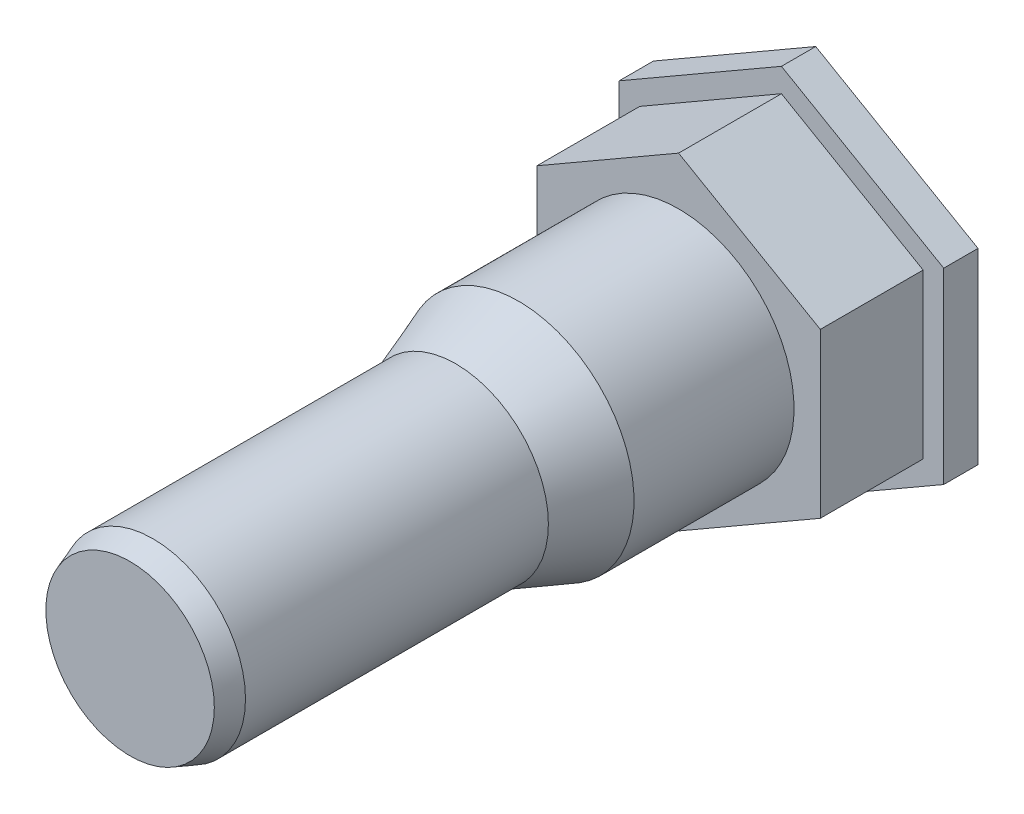
ISO-10303-21;
HEADER;
FILE_DESCRIPTION(('STEP AP214'),'2;1');
FILE_NAME('part.step','',(''),(''),'','','');
FILE_SCHEMA(('AUTOMOTIVE_DESIGN { 1 0 10303 214 1 1 1 1 }'));
ENDSEC;
DATA;
#1=APPLICATION_CONTEXT('core data for automotive mechanical design processes');
#2=APPLICATION_PROTOCOL_DEFINITION('international standard','automotive_design',2000,#1);
#3=PRODUCT_CONTEXT('',#1,'mechanical');
#4=PRODUCT('Part','Part','',(#3));
#5=PRODUCT_RELATED_PRODUCT_CATEGORY('part','',(#4));
#6=PRODUCT_DEFINITION_FORMATION('','',#4);
#7=PRODUCT_DEFINITION_CONTEXT('part definition',#1,'design');
#8=PRODUCT_DEFINITION('design','',#6,#7);
#9=PRODUCT_DEFINITION_SHAPE('','',#8);
#10=(LENGTH_UNIT() NAMED_UNIT(*) SI_UNIT(.MILLI.,.METRE.));
#11=(NAMED_UNIT(*) PLANE_ANGLE_UNIT() SI_UNIT($,.RADIAN.));
#12=(NAMED_UNIT(*) SI_UNIT($,.STERADIAN.) SOLID_ANGLE_UNIT());
#13=UNCERTAINTY_MEASURE_WITH_UNIT(LENGTH_MEASURE(1.E-05),#10,'distance_accuracy_value','');
#14=(GEOMETRIC_REPRESENTATION_CONTEXT(3) GLOBAL_UNCERTAINTY_ASSIGNED_CONTEXT((#13)) GLOBAL_UNIT_ASSIGNED_CONTEXT((#10,
#11,#12)) REPRESENTATION_CONTEXT('',''));
#15=CARTESIAN_POINT('',(0.,0.,0.));
#16=DIRECTION('',(0.,0.,1.));
#17=DIRECTION('',(1.,0.,0.));
#18=AXIS2_PLACEMENT_3D('',#15,#16,#17);
#19=CARTESIAN_POINT('',(-7.1,-4.09918691124635,1.5));
#20=DIRECTION('',(-1.,0.,0.));
#21=DIRECTION('',(0.,0.,1.));
#22=AXIS2_PLACEMENT_3D('',#19,#20,#21);
#23=PLANE('',#22);
#24=DIRECTION('',(0.,1.,0.));
#25=VECTOR('',#24,1.);
#26=CARTESIAN_POINT('',(-7.1,-4.09918691124635,0.));
#27=LINE('',#26,#25);
#28=CARTESIAN_POINT('',(-7.1,-4.09918691124635,0.));
#29=VERTEX_POINT('',#28);
#30=CARTESIAN_POINT('',(-7.1,4.09918691124634,0.));
#31=VERTEX_POINT('',#30);
#32=EDGE_CURVE('E163',#29,#31,#27,.T.);
#33=ORIENTED_EDGE('',*,*,#32,.F.);
#34=DIRECTION('',(0.,0.,-1.));
#35=VECTOR('',#34,1.);
#36=CARTESIAN_POINT('',(-7.1,-4.09918691124635,1.5));
#37=LINE('',#36,#35);
#38=CARTESIAN_POINT('',(-7.1,-4.09918691124635,1.5));
#39=VERTEX_POINT('',#38);
#40=EDGE_CURVE('E87',#39,#29,#37,.T.);
#41=ORIENTED_EDGE('',*,*,#40,.F.);
#42=DIRECTION('',(0.,1.,0.));
#43=VECTOR('',#42,1.);
#44=CARTESIAN_POINT('',(-7.1,-4.09918691124635,1.5));
#45=LINE('',#44,#43);
#46=CARTESIAN_POINT('',(-7.1,4.09918691124634,1.5));
#47=VERTEX_POINT('',#46);
#48=EDGE_CURVE('E179',#39,#47,#45,.T.);
#49=ORIENTED_EDGE('',*,*,#48,.T.);
#50=DIRECTION('',(0.,0.,-1.));
#51=VECTOR('',#50,1.);
#52=CARTESIAN_POINT('',(-7.1,4.09918691124634,1.5));
#53=LINE('',#52,#51);
#54=EDGE_CURVE('E120',#47,#31,#53,.T.);
#55=ORIENTED_EDGE('',*,*,#54,.T.);
#56=EDGE_LOOP('',(#33,#41,#49,#55));
#57=FACE_BOUND('',#56,.T.);
#58=ADVANCED_FACE('F62',(#57),#23,.T.);
#59=CARTESIAN_POINT('',(0.,-8.19837382249269,1.5));
#60=DIRECTION('',(-0.5,-0.866025403784439,0.));
#61=DIRECTION('',(0.866025403784439,-0.5,0.));
#62=AXIS2_PLACEMENT_3D('',#59,#60,#61);
#63=PLANE('',#62);
#64=DIRECTION('',(-0.866025403784438,0.5,0.));
#65=VECTOR('',#64,1.);
#66=CARTESIAN_POINT('',(0.,-8.19837382249269,0.));
#67=LINE('',#66,#65);
#68=CARTESIAN_POINT('',(0.,-8.19837382249269,0.));
#69=VERTEX_POINT('',#68);
#70=EDGE_CURVE('E176',#69,#29,#67,.T.);
#71=ORIENTED_EDGE('',*,*,#70,.F.);
#72=DIRECTION('',(0.,0.,-1.));
#73=VECTOR('',#72,1.);
#74=CARTESIAN_POINT('',(0.,-8.19837382249269,1.5));
#75=LINE('',#74,#73);
#76=CARTESIAN_POINT('',(0.,-8.19837382249269,1.5));
#77=VERTEX_POINT('',#76);
#78=EDGE_CURVE('E144',#77,#69,#75,.T.);
#79=ORIENTED_EDGE('',*,*,#78,.F.);
#80=DIRECTION('',(-0.866025403784438,0.5,0.));
#81=VECTOR('',#80,1.);
#82=CARTESIAN_POINT('',(0.,-8.19837382249269,1.5));
#83=LINE('',#82,#81);
#84=EDGE_CURVE('E153',#77,#39,#83,.T.);
#85=ORIENTED_EDGE('',*,*,#84,.T.);
#86=ORIENTED_EDGE('',*,*,#40,.T.);
#87=EDGE_LOOP('',(#71,#79,#85,#86));
#88=FACE_BOUND('',#87,.T.);
#89=ADVANCED_FACE('F231',(#88),#63,.T.);
#90=CARTESIAN_POINT('',(7.1,-4.09918691124635,1.5));
#91=DIRECTION('',(0.500000000000001,-0.866025403784438,0.));
#92=DIRECTION('',(0.866025403784438,0.500000000000001,0.));
#93=AXIS2_PLACEMENT_3D('',#90,#91,#92);
#94=PLANE('',#93);
#95=DIRECTION('',(-0.866025403784438,-0.500000000000001,0.));
#96=VECTOR('',#95,1.);
#97=CARTESIAN_POINT('',(7.1,-4.09918691124635,0.));
#98=LINE('',#97,#96);
#99=CARTESIAN_POINT('',(7.1,-4.09918691124635,0.));
#100=VERTEX_POINT('',#99);
#101=EDGE_CURVE('E139',#100,#69,#98,.T.);
#102=ORIENTED_EDGE('',*,*,#101,.F.);
#103=DIRECTION('',(0.,0.,-1.));
#104=VECTOR('',#103,1.);
#105=CARTESIAN_POINT('',(7.1,-4.09918691124635,1.5));
#106=LINE('',#105,#104);
#107=CARTESIAN_POINT('',(7.1,-4.09918691124635,1.5));
#108=VERTEX_POINT('',#107);
#109=EDGE_CURVE('E133',#108,#100,#106,.T.);
#110=ORIENTED_EDGE('',*,*,#109,.F.);
#111=DIRECTION('',(-0.866025403784438,-0.500000000000001,0.));
#112=VECTOR('',#111,1.);
#113=CARTESIAN_POINT('',(7.1,-4.09918691124635,1.5));
#114=LINE('',#113,#112);
#115=EDGE_CURVE('E136',#108,#77,#114,.T.);
#116=ORIENTED_EDGE('',*,*,#115,.T.);
#117=ORIENTED_EDGE('',*,*,#78,.T.);
#118=EDGE_LOOP('',(#102,#110,#116,#117));
#119=FACE_BOUND('',#118,.T.);
#120=ADVANCED_FACE('F135',(#119),#94,.T.);
#121=CARTESIAN_POINT('',(7.1,4.09918691124634,1.5));
#122=DIRECTION('',(1.,0.,0.));
#123=DIRECTION('',(0.,0.,-1.));
#124=AXIS2_PLACEMENT_3D('',#121,#122,#123);
#125=PLANE('',#124);
#126=DIRECTION('',(0.,-1.,0.));
#127=VECTOR('',#126,1.);
#128=CARTESIAN_POINT('',(7.1,4.09918691124634,0.));
#129=LINE('',#128,#127);
#130=CARTESIAN_POINT('',(7.1,4.09918691124634,0.));
#131=VERTEX_POINT('',#130);
#132=EDGE_CURVE('E173',#131,#100,#129,.T.);
#133=ORIENTED_EDGE('',*,*,#132,.F.);
#134=DIRECTION('',(0.,0.,-1.));
#135=VECTOR('',#134,1.);
#136=CARTESIAN_POINT('',(7.1,4.09918691124634,1.5));
#137=LINE('',#136,#135);
#138=CARTESIAN_POINT('',(7.1,4.09918691124634,1.5));
#139=VERTEX_POINT('',#138);
#140=EDGE_CURVE('E145',#139,#131,#137,.T.);
#141=ORIENTED_EDGE('',*,*,#140,.F.);
#142=DIRECTION('',(0.,-1.,0.));
#143=VECTOR('',#142,1.);
#144=CARTESIAN_POINT('',(7.1,4.09918691124634,1.5));
#145=LINE('',#144,#143);
#146=EDGE_CURVE('E151',#139,#108,#145,.T.);
#147=ORIENTED_EDGE('',*,*,#146,.T.);
#148=ORIENTED_EDGE('',*,*,#109,.T.);
#149=EDGE_LOOP('',(#133,#141,#147,#148));
#150=FACE_BOUND('',#149,.T.);
#151=ADVANCED_FACE('F155',(#150),#125,.T.);
#152=CARTESIAN_POINT('',(0.,8.19837382249269,1.5));
#153=DIRECTION('',(0.5,0.866025403784438,0.));
#154=DIRECTION('',(-0.866025403784439,0.5,0.));
#155=AXIS2_PLACEMENT_3D('',#152,#153,#154);
#156=PLANE('',#155);
#157=DIRECTION('',(0.866025403784439,-0.5,0.));
#158=VECTOR('',#157,1.);
#159=CARTESIAN_POINT('',(0.,8.19837382249269,0.));
#160=LINE('',#159,#158);
#161=CARTESIAN_POINT('',(0.,8.19837382249269,0.));
#162=VERTEX_POINT('',#161);
#163=EDGE_CURVE('E170',#162,#131,#160,.T.);
#164=ORIENTED_EDGE('',*,*,#163,.F.);
#165=DIRECTION('',(0.,0.,-1.));
#166=VECTOR('',#165,1.);
#167=CARTESIAN_POINT('',(0.,8.19837382249269,1.5));
#168=LINE('',#167,#166);
#169=CARTESIAN_POINT('',(0.,8.19837382249269,1.5));
#170=VERTEX_POINT('',#169);
#171=EDGE_CURVE('E184',#170,#162,#168,.T.);
#172=ORIENTED_EDGE('',*,*,#171,.F.);
#173=DIRECTION('',(0.866025403784439,-0.5,0.));
#174=VECTOR('',#173,1.);
#175=CARTESIAN_POINT('',(0.,8.19837382249269,1.5));
#176=LINE('',#175,#174);
#177=EDGE_CURVE('E156',#170,#139,#176,.T.);
#178=ORIENTED_EDGE('',*,*,#177,.T.);
#179=ORIENTED_EDGE('',*,*,#140,.T.);
#180=EDGE_LOOP('',(#164,#172,#178,#179));
#181=FACE_BOUND('',#180,.T.);
#182=ADVANCED_FACE('F245',(#181),#156,.T.);
#183=CARTESIAN_POINT('',(-7.1,4.09918691124634,1.5));
#184=DIRECTION('',(-0.500000000000001,0.866025403784438,0.));
#185=DIRECTION('',(-0.866025403784438,-0.500000000000001,0.));
#186=AXIS2_PLACEMENT_3D('',#183,#184,#185);
#187=PLANE('',#186);
#188=DIRECTION('',(0.866025403784438,0.5,0.));
#189=VECTOR('',#188,1.);
#190=CARTESIAN_POINT('',(-7.1,4.09918691124634,0.));
#191=LINE('',#190,#189);
#192=EDGE_CURVE('E166',#31,#162,#191,.T.);
#193=ORIENTED_EDGE('',*,*,#192,.F.);
#194=ORIENTED_EDGE('',*,*,#54,.F.);
#195=DIRECTION('',(0.866025403784438,0.5,0.));
#196=VECTOR('',#195,1.);
#197=CARTESIAN_POINT('',(-7.1,4.09918691124634,1.5));
#198=LINE('',#197,#196);
#199=EDGE_CURVE('E158',#47,#170,#198,.T.);
#200=ORIENTED_EDGE('',*,*,#199,.T.);
#201=ORIENTED_EDGE('',*,*,#171,.T.);
#202=EDGE_LOOP('',(#193,#194,#200,#201));
#203=FACE_BOUND('',#202,.T.);
#204=ADVANCED_FACE('F228',(#203),#187,.T.);
#205=CARTESIAN_POINT('',(0.,0.,1.5));
#206=DIRECTION('',(0.,0.,-1.));
#207=DIRECTION('',(-1.,0.,0.));
#208=AXIS2_PLACEMENT_3D('',#205,#206,#207);
#209=PLANE('',#208);
#210=DIRECTION('',(-0.866025403784438,-0.500000000000001,0.));
#211=VECTOR('',#210,1.);
#212=CARTESIAN_POINT('',(3.1,-5.36935750346352,1.5));
#213=LINE('',#212,#211);
#214=CARTESIAN_POINT('',(6.2,-3.57957166897568,1.5));
#215=VERTEX_POINT('',#214);
#216=CARTESIAN_POINT('',(0.,-7.15914333795136,1.5));
#217=VERTEX_POINT('',#216);
#218=EDGE_CURVE('E224',#215,#217,#213,.T.);
#219=ORIENTED_EDGE('',*,*,#218,.T.);
#220=DIRECTION('',(-0.866025403784439,0.5,0.));
#221=VECTOR('',#220,1.);
#222=CARTESIAN_POINT('',(-3.1,-5.36935750346352,1.5));
#223=LINE('',#222,#221);
#224=CARTESIAN_POINT('',(-6.2,-3.57957166897568,1.5));
#225=VERTEX_POINT('',#224);
#226=EDGE_CURVE('E219',#217,#225,#223,.T.);
#227=ORIENTED_EDGE('',*,*,#226,.T.);
#228=DIRECTION('',(0.,1.,0.));
#229=VECTOR('',#228,1.);
#230=CARTESIAN_POINT('',(-6.2,0.,1.5));
#231=LINE('',#230,#229);
#232=CARTESIAN_POINT('',(-6.2,3.57957166897568,1.5));
#233=VERTEX_POINT('',#232);
#234=EDGE_CURVE('E322',#225,#233,#231,.T.);
#235=ORIENTED_EDGE('',*,*,#234,.T.);
#236=DIRECTION('',(0.866025403784438,0.500000000000001,0.));
#237=VECTOR('',#236,1.);
#238=CARTESIAN_POINT('',(-3.1,5.36935750346352,1.5));
#239=LINE('',#238,#237);
#240=CARTESIAN_POINT('',(0.,7.15914333795136,1.5));
#241=VERTEX_POINT('',#240);
#242=EDGE_CURVE('E319',#233,#241,#239,.T.);
#243=ORIENTED_EDGE('',*,*,#242,.T.);
#244=DIRECTION('',(0.866025403784439,-0.5,0.));
#245=VECTOR('',#244,1.);
#246=CARTESIAN_POINT('',(3.1,5.36935750346352,1.5));
#247=LINE('',#246,#245);
#248=CARTESIAN_POINT('',(6.2,3.57957166897568,1.5));
#249=VERTEX_POINT('',#248);
#250=EDGE_CURVE('E315',#241,#249,#247,.T.);
#251=ORIENTED_EDGE('',*,*,#250,.T.);
#252=DIRECTION('',(0.,-1.,0.));
#253=VECTOR('',#252,1.);
#254=CARTESIAN_POINT('',(6.2,0.,1.5));
#255=LINE('',#254,#253);
#256=EDGE_CURVE('E310',#249,#215,#255,.T.);
#257=ORIENTED_EDGE('',*,*,#256,.T.);
#258=EDGE_LOOP('',(#219,#227,#235,#243,#251,#257));
#259=FACE_BOUND('',#258,.T.);
#260=ORIENTED_EDGE('',*,*,#48,.F.);
#261=ORIENTED_EDGE('',*,*,#84,.F.);
#262=ORIENTED_EDGE('',*,*,#115,.F.);
#263=ORIENTED_EDGE('',*,*,#146,.F.);
#264=ORIENTED_EDGE('',*,*,#177,.F.);
#265=ORIENTED_EDGE('',*,*,#199,.F.);
#266=EDGE_LOOP('',(#260,#261,#262,#263,#264,#265));
#267=FACE_BOUND('',#266,.T.);
#268=ADVANCED_FACE('F149',(#259,#267),#209,.F.);
#269=CARTESIAN_POINT('',(0.,0.,0.));
#270=DIRECTION('',(0.,0.,-1.));
#271=DIRECTION('',(-1.,0.,0.));
#272=AXIS2_PLACEMENT_3D('',#269,#270,#271);
#273=PLANE('',#272);
#274=ORIENTED_EDGE('',*,*,#32,.T.);
#275=ORIENTED_EDGE('',*,*,#192,.T.);
#276=ORIENTED_EDGE('',*,*,#163,.T.);
#277=ORIENTED_EDGE('',*,*,#132,.T.);
#278=ORIENTED_EDGE('',*,*,#101,.T.);
#279=ORIENTED_EDGE('',*,*,#70,.T.);
#280=EDGE_LOOP('',(#274,#275,#276,#277,#278,#279));
#281=FACE_BOUND('',#280,.T.);
#282=CARTESIAN_POINT('',(0.,0.,0.));
#283=DIRECTION('',(0.,0.,1.));
#284=DIRECTION('',(1.,0.,0.));
#285=AXIS2_PLACEMENT_3D('',#282,#283,#284);
#286=CIRCLE('',#285,3.05);
#287=CARTESIAN_POINT('',(-3.05,0.,0.));
#288=VERTEX_POINT('',#287);
#289=EDGE_CURVE('E217',#288,#288,#286,.T.);
#290=ORIENTED_EDGE('',*,*,#289,.T.);
#291=EDGE_LOOP('',(#290));
#292=FACE_BOUND('',#291,.T.);
#293=ADVANCED_FACE('F213',(#281,#292),#273,.T.);
#294=CARTESIAN_POINT('',(0.,0.,13.));
#295=DIRECTION('',(0.,0.,-1.));
#296=DIRECTION('',(-1.,0.,0.));
#297=AXIS2_PLACEMENT_3D('',#294,#295,#296);
#298=CYLINDRICAL_SURFACE('',#297,3.05);
#299=CARTESIAN_POINT('',(0.,0.,11.0226497308104));
#300=DIRECTION('',(0.,0.,-1.));
#301=DIRECTION('',(-1.,0.,0.));
#302=AXIS2_PLACEMENT_3D('',#299,#300,#301);
#303=CIRCLE('',#302,3.05);
#304=CARTESIAN_POINT('',(-3.05,0.,11.0226497308104));
#305=VERTEX_POINT('',#304);
#306=EDGE_CURVE('E12',#305,#305,#303,.F.);
#307=CARTESIAN_POINT('',(-3.05,0.,11.0226497308104));
#308=CARTESIAN_POINT('',(-3.05,0.,10.9078304627811));
#309=CARTESIAN_POINT('',(-3.05,0.,10.7930111947518));
#310=CARTESIAN_POINT('',(-3.05,0.,10.5633726586933));
#311=CARTESIAN_POINT('',(-3.05,0.,10.448553390664));
#312=CARTESIAN_POINT('',(-3.05,0.,10.2189148546055));
#313=CARTESIAN_POINT('',(-3.05,0.,10.1040955865762));
#314=CARTESIAN_POINT('',(-3.05,0.,9.87445705051764));
#315=CARTESIAN_POINT('',(-3.05,0.,9.75963778248836));
#316=CARTESIAN_POINT('',(-3.05,0.,9.52999924642982));
#317=CARTESIAN_POINT('',(-3.05,0.,9.41517997840054));
#318=CARTESIAN_POINT('',(-3.05,0.,9.18554144234199));
#319=CARTESIAN_POINT('',(-3.05,0.,9.07072217431272));
#320=CARTESIAN_POINT('',(-3.05,0.,8.84108363825417));
#321=CARTESIAN_POINT('',(-3.05,0.,8.72626437022489));
#322=CARTESIAN_POINT('',(-3.05,0.,8.49662583416634));
#323=CARTESIAN_POINT('',(-3.05,0.,8.38180656613707));
#324=CARTESIAN_POINT('',(-3.05,0.,8.15216803007852));
#325=CARTESIAN_POINT('',(-3.05,0.,8.03734876204924));
#326=CARTESIAN_POINT('',(-3.05,0.,7.80771022599069));
#327=CARTESIAN_POINT('',(-3.05,0.,7.69289095796142));
#328=CARTESIAN_POINT('',(-3.05,0.,7.46325242190287));
#329=CARTESIAN_POINT('',(-3.05,0.,7.34843315387359));
#330=CARTESIAN_POINT('',(-3.05,0.,7.11879461781504));
#331=CARTESIAN_POINT('',(-3.05,0.,7.00397534978577));
#332=CARTESIAN_POINT('',(-3.05,0.,6.77433681372722));
#333=CARTESIAN_POINT('',(-3.05,0.,6.65951754569794));
#334=CARTESIAN_POINT('',(-3.05,0.,6.42987900963939));
#335=CARTESIAN_POINT('',(-3.05,0.,6.31505974161012));
#336=CARTESIAN_POINT('',(-3.05,0.,6.08542120555157));
#337=CARTESIAN_POINT('',(-3.05,0.,5.97060193752229));
#338=CARTESIAN_POINT('',(-3.05,0.,5.74096340146374));
#339=CARTESIAN_POINT('',(-3.05,0.,5.62614413343447));
#340=CARTESIAN_POINT('',(-3.05,0.,5.39650559737592));
#341=CARTESIAN_POINT('',(-3.05,0.,5.28168632934664));
#342=CARTESIAN_POINT('',(-3.05,0.,5.05204779328809));
#343=CARTESIAN_POINT('',(-3.05,0.,4.93722852525882));
#344=CARTESIAN_POINT('',(-3.05,0.,4.70758998920027));
#345=CARTESIAN_POINT('',(-3.05,0.,4.59277072117099));
#346=CARTESIAN_POINT('',(-3.05,0.,4.36313218511244));
#347=CARTESIAN_POINT('',(-3.05,0.,4.24831291708317));
#348=CARTESIAN_POINT('',(-3.05,0.,4.01867438102462));
#349=CARTESIAN_POINT('',(-3.05,0.,3.90385511299535));
#350=CARTESIAN_POINT('',(-3.05,0.,3.6742165769368));
#351=CARTESIAN_POINT('',(-3.05,0.,3.55939730890752));
#352=CARTESIAN_POINT('',(-3.05,0.,3.32975877284897));
#353=CARTESIAN_POINT('',(-3.05,0.,3.2149395048197));
#354=CARTESIAN_POINT('',(-3.05,0.,2.98530096876115));
#355=CARTESIAN_POINT('',(-3.05,0.,2.87048170073187));
#356=CARTESIAN_POINT('',(-3.05,0.,2.64084316467332));
#357=CARTESIAN_POINT('',(-3.05,0.,2.52602389664405));
#358=CARTESIAN_POINT('',(-3.05,0.,2.2963853605855));
#359=CARTESIAN_POINT('',(-3.05,0.,2.18156609255622));
#360=CARTESIAN_POINT('',(-3.05,0.,1.95192755649767));
#361=CARTESIAN_POINT('',(-3.05,0.,1.8371082884684));
#362=CARTESIAN_POINT('',(-3.05,0.,1.60746975240985));
#363=CARTESIAN_POINT('',(-3.05,0.,1.49265048438057));
#364=CARTESIAN_POINT('',(-3.05,0.,1.26301194832202));
#365=CARTESIAN_POINT('',(-3.05,0.,1.14819268029275));
#366=CARTESIAN_POINT('',(-3.05,0.,0.918554144234198));
#367=CARTESIAN_POINT('',(-3.05,0.,0.803734876204923));
#368=CARTESIAN_POINT('',(-3.05,0.,0.574096340146373));
#369=CARTESIAN_POINT('',(-3.05,0.,0.459277072117098));
#370=CARTESIAN_POINT('',(-3.05,0.,0.229638536058549));
#371=CARTESIAN_POINT('',(-3.05,0.,0.114819268029274));
#372=CARTESIAN_POINT('',(-3.05,0.,0.));
#373=B_SPLINE_CURVE_WITH_KNOTS('',3,(#307,#308,#309,#310,#311,#312,#313,#314,#315,#316,#317,
#318,#319,#320,#321,#322,#323,#324,#325,#326,#327,#328,#329,#330,#331,#332,#333,#334,#335,#336,
#337,#338,#339,#340,#341,#342,#343,#344,#345,#346,#347,#348,#349,#350,#351,#352,#353,#354,#355,
#356,#357,#358,#359,#360,#361,#362,#363,#364,#365,#366,#367,#368,#369,#370,#371,#372),
.UNSPECIFIED.,.F.,.F.,(4,2,2,2,2,2,2,2,2,2,2,2,2,2,2,2,2,2,2,2,2,2,2,2,2,2,2,2,2,2,2,2,4),(0.,
0.344457804087825,0.68891560817565,1.03337341226347,1.3778312163513,1.72228902043912,
2.06674682452695,2.41120462861477,2.7556624327026,3.10012023679042,3.44457804087825,
3.78903584496607,4.1334936490539,4.47795145314172,4.82240925722955,5.16686706131737,
5.51132486540519,5.85578266949302,6.20024047358084,6.54469827766867,6.88915608175649,
7.23361388584432,7.57807168993214,7.92252949401997,8.26698729810779,8.61144510219562,
8.95590290628344,9.30036071037127,9.64481851445909,9.98927631854692,10.3337341226347,
10.6781919267226,11.0226497308104),.UNSPECIFIED.);
#374=EDGE_CURVE('BSEAM209',#305,#288,#373,.T.);
#375=ORIENTED_EDGE('',*,*,#306,.T.);
#376=ORIENTED_EDGE('',*,*,#289,.F.);
#377=ORIENTED_EDGE('',*,*,#374,.T.);
#378=ORIENTED_EDGE('',*,*,#374,.F.);
#379=EDGE_LOOP('',(#375,#377,#376,#378));
#380=FACE_BOUND('',#379,.T.);
#381=ADVANCED_FACE('F209',(#380),#298,.F.);
#382=CARTESIAN_POINT('',(0.,0.,28.));
#383=DIRECTION('',(0.,0.,1.));
#384=DIRECTION('',(1.,0.,0.));
#385=AXIS2_PLACEMENT_3D('',#382,#383,#384);
#386=PLANE('',#385);
#387=CARTESIAN_POINT('',(0.,0.,28.));
#388=DIRECTION('',(0.,0.,1.));
#389=DIRECTION('',(1.,0.,0.));
#390=AXIS2_PLACEMENT_3D('',#387,#388,#389);
#391=CIRCLE('',#390,2.05);
#392=CARTESIAN_POINT('',(2.05,0.,28.));
#393=VERTEX_POINT('',#392);
#394=EDGE_CURVE('E181',#393,#393,#391,.T.);
#395=ORIENTED_EDGE('',*,*,#394,.F.);
#396=EDGE_LOOP('',(#395));
#397=FACE_BOUND('',#396,.T.);
#398=ADVANCED_FACE('F212',(#397),#386,.F.);
#399=CARTESIAN_POINT('',(0.,0.,30.));
#400=DIRECTION('',(0.,0.,-1.));
#401=DIRECTION('',(-1.,0.,0.));
#402=AXIS2_PLACEMENT_3D('',#399,#400,#401);
#403=CYLINDRICAL_SURFACE('',#402,2.05);
#404=CARTESIAN_POINT('',(0.,0.,11.6));
#405=DIRECTION('',(0.,0.,1.));
#406=DIRECTION('',(1.,0.,0.));
#407=AXIS2_PLACEMENT_3D('',#404,#405,#406);
#408=CIRCLE('',#407,2.05);
#409=CARTESIAN_POINT('',(2.05,0.,11.6));
#410=VERTEX_POINT('',#409);
#411=EDGE_CURVE('E71',#410,#410,#408,.F.);
#412=ORIENTED_EDGE('',*,*,#411,.T.);
#413=EDGE_LOOP('',(#412));
#414=FACE_BOUND('',#413,.T.);
#415=ORIENTED_EDGE('',*,*,#394,.T.);
#416=EDGE_LOOP('',(#415));
#417=FACE_BOUND('',#416,.T.);
#418=ADVANCED_FACE('F201',(#414,#417),#403,.F.);
#419=CARTESIAN_POINT('',(0.,-7.15914333795136,6.));
#420=DIRECTION('',(-0.5,-0.866025403784438,0.));
#421=DIRECTION('',(0.866025403784439,-0.5,0.));
#422=AXIS2_PLACEMENT_3D('',#419,#420,#421);
#423=PLANE('',#422);
#424=ORIENTED_EDGE('',*,*,#226,.F.);
#425=DIRECTION('',(0.,0.,-1.));
#426=VECTOR('',#425,1.);
#427=CARTESIAN_POINT('',(0.,-7.15914333795136,6.));
#428=LINE('',#427,#426);
#429=CARTESIAN_POINT('',(0.,-7.15914333795136,6.));
#430=VERTEX_POINT('',#429);
#431=EDGE_CURVE('E324',#430,#217,#428,.T.);
#432=ORIENTED_EDGE('',*,*,#431,.F.);
#433=DIRECTION('',(-0.866025403784439,0.5,0.));
#434=VECTOR('',#433,1.);
#435=CARTESIAN_POINT('',(0.,-7.15914333795136,6.));
#436=LINE('',#435,#434);
#437=CARTESIAN_POINT('',(-6.2,-3.57957166897568,6.));
#438=VERTEX_POINT('',#437);
#439=EDGE_CURVE('E354',#430,#438,#436,.T.);
#440=ORIENTED_EDGE('',*,*,#439,.T.);
#441=DIRECTION('',(0.,0.,-1.));
#442=VECTOR('',#441,1.);
#443=CARTESIAN_POINT('',(-6.2,-3.57957166897568,6.));
#444=LINE('',#443,#442);
#445=EDGE_CURVE('E327',#438,#225,#444,.T.);
#446=ORIENTED_EDGE('',*,*,#445,.T.);
#447=EDGE_LOOP('',(#424,#432,#440,#446));
#448=FACE_BOUND('',#447,.T.);
#449=ADVANCED_FACE('F256',(#448),#423,.T.);
#450=CARTESIAN_POINT('',(6.2,-3.57957166897568,6.));
#451=DIRECTION('',(0.500000000000001,-0.866025403784438,0.));
#452=DIRECTION('',(0.866025403784438,0.500000000000001,0.));
#453=AXIS2_PLACEMENT_3D('',#450,#451,#452);
#454=PLANE('',#453);
#455=ORIENTED_EDGE('',*,*,#218,.F.);
#456=DIRECTION('',(0.,0.,-1.));
#457=VECTOR('',#456,1.);
#458=CARTESIAN_POINT('',(6.2,-3.57957166897568,6.));
#459=LINE('',#458,#457);
#460=CARTESIAN_POINT('',(6.2,-3.57957166897568,6.));
#461=VERTEX_POINT('',#460);
#462=EDGE_CURVE('E338',#461,#215,#459,.T.);
#463=ORIENTED_EDGE('',*,*,#462,.F.);
#464=DIRECTION('',(-0.866025403784438,-0.500000000000001,0.));
#465=VECTOR('',#464,1.);
#466=CARTESIAN_POINT('',(6.2,-3.57957166897568,6.));
#467=LINE('',#466,#465);
#468=EDGE_CURVE('E330',#461,#430,#467,.T.);
#469=ORIENTED_EDGE('',*,*,#468,.T.);
#470=ORIENTED_EDGE('',*,*,#431,.T.);
#471=EDGE_LOOP('',(#455,#463,#469,#470));
#472=FACE_BOUND('',#471,.T.);
#473=ADVANCED_FACE('F371',(#472),#454,.T.);
#474=CARTESIAN_POINT('',(6.2,3.57957166897568,6.));
#475=DIRECTION('',(1.,0.,0.));
#476=DIRECTION('',(0.,1.,0.));
#477=AXIS2_PLACEMENT_3D('',#474,#475,#476);
#478=PLANE('',#477);
#479=ORIENTED_EDGE('',*,*,#256,.F.);
#480=DIRECTION('',(0.,0.,-1.));
#481=VECTOR('',#480,1.);
#482=CARTESIAN_POINT('',(6.2,3.57957166897568,6.));
#483=LINE('',#482,#481);
#484=CARTESIAN_POINT('',(6.2,3.57957166897568,6.));
#485=VERTEX_POINT('',#484);
#486=EDGE_CURVE('E335',#485,#249,#483,.T.);
#487=ORIENTED_EDGE('',*,*,#486,.F.);
#488=DIRECTION('',(0.,-1.,0.));
#489=VECTOR('',#488,1.);
#490=CARTESIAN_POINT('',(6.2,3.57957166897568,6.));
#491=LINE('',#490,#489);
#492=EDGE_CURVE('E343',#485,#461,#491,.T.);
#493=ORIENTED_EDGE('',*,*,#492,.T.);
#494=ORIENTED_EDGE('',*,*,#462,.T.);
#495=EDGE_LOOP('',(#479,#487,#493,#494));
#496=FACE_BOUND('',#495,.T.);
#497=ADVANCED_FACE('F376',(#496),#478,.T.);
#498=CARTESIAN_POINT('',(0.,7.15914333795136,6.));
#499=DIRECTION('',(0.5,0.866025403784439,0.));
#500=DIRECTION('',(-0.866025403784439,0.5,0.));
#501=AXIS2_PLACEMENT_3D('',#498,#499,#500);
#502=PLANE('',#501);
#503=ORIENTED_EDGE('',*,*,#250,.F.);
#504=DIRECTION('',(0.,0.,-1.));
#505=VECTOR('',#504,1.);
#506=CARTESIAN_POINT('',(0.,7.15914333795136,6.));
#507=LINE('',#506,#505);
#508=CARTESIAN_POINT('',(0.,7.15914333795136,6.));
#509=VERTEX_POINT('',#508);
#510=EDGE_CURVE('E332',#509,#241,#507,.T.);
#511=ORIENTED_EDGE('',*,*,#510,.F.);
#512=DIRECTION('',(0.866025403784439,-0.5,0.));
#513=VECTOR('',#512,1.);
#514=CARTESIAN_POINT('',(0.,7.15914333795136,6.));
#515=LINE('',#514,#513);
#516=EDGE_CURVE('E346',#509,#485,#515,.T.);
#517=ORIENTED_EDGE('',*,*,#516,.T.);
#518=ORIENTED_EDGE('',*,*,#486,.T.);
#519=EDGE_LOOP('',(#503,#511,#517,#518));
#520=FACE_BOUND('',#519,.T.);
#521=ADVANCED_FACE('F383',(#520),#502,.T.);
#522=CARTESIAN_POINT('',(-6.2,3.57957166897568,6.));
#523=DIRECTION('',(-0.5,0.866025403784438,0.));
#524=DIRECTION('',(-0.866025403784438,-0.500000000000001,0.));
#525=AXIS2_PLACEMENT_3D('',#522,#523,#524);
#526=PLANE('',#525);
#527=ORIENTED_EDGE('',*,*,#242,.F.);
#528=DIRECTION('',(0.,0.,-1.));
#529=VECTOR('',#528,1.);
#530=CARTESIAN_POINT('',(-6.2,3.57957166897568,6.));
#531=LINE('',#530,#529);
#532=CARTESIAN_POINT('',(-6.2,3.57957166897568,6.));
#533=VERTEX_POINT('',#532);
#534=EDGE_CURVE('E78',#533,#233,#531,.T.);
#535=ORIENTED_EDGE('',*,*,#534,.F.);
#536=DIRECTION('',(0.866025403784438,0.500000000000001,0.));
#537=VECTOR('',#536,1.);
#538=CARTESIAN_POINT('',(-6.2,3.57957166897568,6.));
#539=LINE('',#538,#537);
#540=EDGE_CURVE('E349',#533,#509,#539,.T.);
#541=ORIENTED_EDGE('',*,*,#540,.T.);
#542=ORIENTED_EDGE('',*,*,#510,.T.);
#543=EDGE_LOOP('',(#527,#535,#541,#542));
#544=FACE_BOUND('',#543,.T.);
#545=ADVANCED_FACE('F388',(#544),#526,.T.);
#546=CARTESIAN_POINT('',(-6.2,-3.57957166897568,6.));
#547=DIRECTION('',(-1.,0.,0.));
#548=DIRECTION('',(0.,-1.,0.));
#549=AXIS2_PLACEMENT_3D('',#546,#547,#548);
#550=PLANE('',#549);
#551=ORIENTED_EDGE('',*,*,#234,.F.);
#552=ORIENTED_EDGE('',*,*,#445,.F.);
#553=DIRECTION('',(0.,1.,0.));
#554=VECTOR('',#553,1.);
#555=CARTESIAN_POINT('',(-6.2,-3.57957166897568,6.));
#556=LINE('',#555,#554);
#557=EDGE_CURVE('E352',#438,#533,#556,.T.);
#558=ORIENTED_EDGE('',*,*,#557,.T.);
#559=ORIENTED_EDGE('',*,*,#534,.T.);
#560=EDGE_LOOP('',(#551,#552,#558,#559));
#561=FACE_BOUND('',#560,.T.);
#562=ADVANCED_FACE('F291',(#561),#550,.T.);
#563=CARTESIAN_POINT('',(0.,0.,6.));
#564=DIRECTION('',(0.,0.,-1.));
#565=DIRECTION('',(-1.,0.,0.));
#566=AXIS2_PLACEMENT_3D('',#563,#564,#565);
#567=PLANE('',#566);
#568=ORIENTED_EDGE('',*,*,#439,.F.);
#569=ORIENTED_EDGE('',*,*,#468,.F.);
#570=ORIENTED_EDGE('',*,*,#492,.F.);
#571=ORIENTED_EDGE('',*,*,#516,.F.);
#572=ORIENTED_EDGE('',*,*,#540,.F.);
#573=ORIENTED_EDGE('',*,*,#557,.F.);
#574=EDGE_LOOP('',(#568,#569,#570,#571,#572,#573));
#575=FACE_BOUND('',#574,.T.);
#576=CARTESIAN_POINT('',(0.,0.,6.));
#577=DIRECTION('',(0.,0.,-1.));
#578=DIRECTION('',(-1.,0.,0.));
#579=AXIS2_PLACEMENT_3D('',#576,#577,#578);
#580=CIRCLE('',#579,5.05);
#581=CARTESIAN_POINT('',(-5.05,0.,6.));
#582=VERTEX_POINT('',#581);
#583=EDGE_CURVE('E189',#582,#582,#580,.T.);
#584=ORIENTED_EDGE('',*,*,#583,.T.);
#585=EDGE_LOOP('',(#584));
#586=FACE_BOUND('',#585,.T.);
#587=ADVANCED_FACE('F285',(#575,#586),#567,.F.);
#588=CARTESIAN_POINT('',(0.,0.,30.));
#589=DIRECTION('',(0.,0.,1.));
#590=DIRECTION('',(1.,0.,0.));
#591=AXIS2_PLACEMENT_3D('',#588,#589,#590);
#592=PLANE('',#591);
#593=CARTESIAN_POINT('',(0.,0.,30.));
#594=DIRECTION('',(0.,0.,1.));
#595=DIRECTION('',(1.,0.,0.));
#596=AXIS2_PLACEMENT_3D('',#593,#594,#595);
#597=CIRCLE('',#596,3.6860297657338);
#598=CARTESIAN_POINT('',(3.6860297657338,0.,30.));
#599=VERTEX_POINT('',#598);
#600=EDGE_CURVE('E190',#599,#599,#597,.T.);
#601=ORIENTED_EDGE('',*,*,#600,.T.);
#602=EDGE_LOOP('',(#601));
#603=FACE_BOUND('',#602,.T.);
#604=ADVANCED_FACE('F278',(#603),#592,.T.);
#605=CARTESIAN_POINT('',(0.,0.,30.));
#606=DIRECTION('',(0.,0.,-1.));
#607=DIRECTION('',(-1.,0.,0.));
#608=AXIS2_PLACEMENT_3D('',#605,#606,#607);
#609=CYLINDRICAL_SURFACE('',#608,4.05);
#610=CARTESIAN_POINT('',(0.,0.,15.7474774194547));
#611=DIRECTION('',(0.,0.,1.));
#612=DIRECTION('',(1.,0.,0.));
#613=AXIS2_PLACEMENT_3D('',#610,#611,#612);
#614=CIRCLE('',#613,4.05);
#615=CARTESIAN_POINT('',(4.05,0.,15.7474774194547));
#616=VERTEX_POINT('',#615);
#617=EDGE_CURVE('E196',#616,#616,#614,.T.);
#618=ORIENTED_EDGE('',*,*,#617,.T.);
#619=EDGE_LOOP('',(#618));
#620=FACE_BOUND('',#619,.T.);
#621=CARTESIAN_POINT('',(0.,0.,29.));
#622=DIRECTION('',(0.,0.,1.));
#623=DIRECTION('',(1.,0.,0.));
#624=AXIS2_PLACEMENT_3D('',#621,#622,#623);
#625=CIRCLE('',#624,4.05);
#626=CARTESIAN_POINT('',(4.05,0.,29.));
#627=VERTEX_POINT('',#626);
#628=EDGE_CURVE('E193',#627,#627,#625,.F.);
#629=ORIENTED_EDGE('',*,*,#628,.T.);
#630=EDGE_LOOP('',(#629));
#631=FACE_BOUND('',#630,.T.);
#632=ADVANCED_FACE('F276',(#620,#631),#609,.T.);
#633=CARTESIAN_POINT('',(0.,0.,13.));
#634=DIRECTION('',(0.,0.,-1.));
#635=DIRECTION('',(-1.,0.,0.));
#636=AXIS2_PLACEMENT_3D('',#633,#634,#635);
#637=CYLINDRICAL_SURFACE('',#636,5.05);
#638=CARTESIAN_POINT('',(0.,0.,13.));
#639=DIRECTION('',(0.,0.,1.));
#640=DIRECTION('',(1.,0.,0.));
#641=AXIS2_PLACEMENT_3D('',#638,#639,#640);
#642=CIRCLE('',#641,5.05);
#643=CARTESIAN_POINT('',(-5.05,0.,13.));
#644=VERTEX_POINT('',#643);
#645=EDGE_CURVE('E167',#644,#644,#642,.T.);
#646=CARTESIAN_POINT('',(-5.05,0.,13.));
#647=CARTESIAN_POINT('',(-5.05,0.,12.9270833333333));
#648=CARTESIAN_POINT('',(-5.05,0.,12.8541666666667));
#649=CARTESIAN_POINT('',(-5.05,0.,12.7083333333333));
#650=CARTESIAN_POINT('',(-5.05,0.,12.6354166666667));
#651=CARTESIAN_POINT('',(-5.05,0.,12.4895833333333));
#652=CARTESIAN_POINT('',(-5.05,0.,12.4166666666667));
#653=CARTESIAN_POINT('',(-5.05,0.,12.2708333333333));
#654=CARTESIAN_POINT('',(-5.05,0.,12.1979166666667));
#655=CARTESIAN_POINT('',(-5.05,0.,12.0520833333333));
#656=CARTESIAN_POINT('',(-5.05,0.,11.9791666666667));
#657=CARTESIAN_POINT('',(-5.05,0.,11.8333333333333));
#658=CARTESIAN_POINT('',(-5.05,0.,11.7604166666667));
#659=CARTESIAN_POINT('',(-5.05,0.,11.6145833333333));
#660=CARTESIAN_POINT('',(-5.05,0.,11.5416666666667));
#661=CARTESIAN_POINT('',(-5.05,0.,11.3958333333333));
#662=CARTESIAN_POINT('',(-5.05,0.,11.3229166666667));
#663=CARTESIAN_POINT('',(-5.05,0.,11.1770833333333));
#664=CARTESIAN_POINT('',(-5.05,0.,11.1041666666667));
#665=CARTESIAN_POINT('',(-5.05,0.,10.9583333333333));
#666=CARTESIAN_POINT('',(-5.05,0.,10.8854166666667));
#667=CARTESIAN_POINT('',(-5.05,0.,10.7395833333333));
#668=CARTESIAN_POINT('',(-5.05,0.,10.6666666666667));
#669=CARTESIAN_POINT('',(-5.05,0.,10.5208333333333));
#670=CARTESIAN_POINT('',(-5.05,0.,10.4479166666667));
#671=CARTESIAN_POINT('',(-5.05,0.,10.3020833333333));
#672=CARTESIAN_POINT('',(-5.05,0.,10.2291666666667));
#673=CARTESIAN_POINT('',(-5.05,0.,10.0833333333333));
#674=CARTESIAN_POINT('',(-5.05,0.,10.0104166666667));
#675=CARTESIAN_POINT('',(-5.05,0.,9.86458333333333));
#676=CARTESIAN_POINT('',(-5.05,0.,9.79166666666667));
#677=CARTESIAN_POINT('',(-5.05,0.,9.64583333333333));
#678=CARTESIAN_POINT('',(-5.05,0.,9.57291666666667));
#679=CARTESIAN_POINT('',(-5.05,0.,9.42708333333333));
#680=CARTESIAN_POINT('',(-5.05,0.,9.35416666666667));
#681=CARTESIAN_POINT('',(-5.05,0.,9.20833333333333));
#682=CARTESIAN_POINT('',(-5.05,0.,9.13541666666667));
#683=CARTESIAN_POINT('',(-5.05,0.,8.98958333333333));
#684=CARTESIAN_POINT('',(-5.05,0.,8.91666666666667));
#685=CARTESIAN_POINT('',(-5.05,0.,8.77083333333333));
#686=CARTESIAN_POINT('',(-5.05,0.,8.69791666666667));
#687=CARTESIAN_POINT('',(-5.05,0.,8.55208333333333));
#688=CARTESIAN_POINT('',(-5.05,0.,8.47916666666667));
#689=CARTESIAN_POINT('',(-5.05,0.,8.33333333333333));
#690=CARTESIAN_POINT('',(-5.05,0.,8.26041666666667));
#691=CARTESIAN_POINT('',(-5.05,0.,8.11458333333333));
#692=CARTESIAN_POINT('',(-5.05,0.,8.04166666666667));
#693=CARTESIAN_POINT('',(-5.05,0.,7.89583333333333));
#694=CARTESIAN_POINT('',(-5.05,0.,7.82291666666667));
#695=CARTESIAN_POINT('',(-5.05,0.,7.67708333333333));
#696=CARTESIAN_POINT('',(-5.05,0.,7.60416666666667));
#697=CARTESIAN_POINT('',(-5.05,0.,7.45833333333333));
#698=CARTESIAN_POINT('',(-5.05,0.,7.38541666666667));
#699=CARTESIAN_POINT('',(-5.05,0.,7.23958333333333));
#700=CARTESIAN_POINT('',(-5.05,0.,7.16666666666667));
#701=CARTESIAN_POINT('',(-5.05,0.,7.02083333333333));
#702=CARTESIAN_POINT('',(-5.05,0.,6.94791666666667));
#703=CARTESIAN_POINT('',(-5.05,0.,6.80208333333333));
#704=CARTESIAN_POINT('',(-5.05,0.,6.72916666666667));
#705=CARTESIAN_POINT('',(-5.05,0.,6.58333333333333));
#706=CARTESIAN_POINT('',(-5.05,0.,6.51041666666667));
#707=CARTESIAN_POINT('',(-5.05,0.,6.36458333333333));
#708=CARTESIAN_POINT('',(-5.05,0.,6.29166666666667));
#709=CARTESIAN_POINT('',(-5.05,0.,6.14583333333333));
#710=CARTESIAN_POINT('',(-5.05,0.,6.07291666666667));
#711=CARTESIAN_POINT('',(-5.05,0.,6.));
#712=B_SPLINE_CURVE_WITH_KNOTS('',3,(#646,#647,#648,#649,#650,#651,#652,#653,#654,#655,#656,
#657,#658,#659,#660,#661,#662,#663,#664,#665,#666,#667,#668,#669,#670,#671,#672,#673,#674,#675,
#676,#677,#678,#679,#680,#681,#682,#683,#684,#685,#686,#687,#688,#689,#690,#691,#692,#693,#694,
#695,#696,#697,#698,#699,#700,#701,#702,#703,#704,#705,#706,#707,#708,#709,#710,#711),
.UNSPECIFIED.,.F.,.F.,(4,2,2,2,2,2,2,2,2,2,2,2,2,2,2,2,2,2,2,2,2,2,2,2,2,2,2,2,2,2,2,2,4),(0.,
0.218749999999998,0.437499999999999,0.656249999999999,0.874999999999999,1.09375,1.3125,1.53125,
1.75,1.96875,2.1875,2.40625,2.625,2.84375,3.0625,3.28125,3.5,3.71875,3.9375,4.15625,4.375,
4.59375,4.8125,5.03125,5.25,5.46875,5.6875,5.90625,6.125,6.34375,6.5625,6.78125,7.),.UNSPECIFIED.);
#713=EDGE_CURVE('BSEAM263',#644,#582,#712,.T.);
#714=ORIENTED_EDGE('',*,*,#645,.F.);
#715=ORIENTED_EDGE('',*,*,#583,.F.);
#716=ORIENTED_EDGE('',*,*,#713,.T.);
#717=ORIENTED_EDGE('',*,*,#713,.F.);
#718=EDGE_LOOP('',(#714,#716,#715,#717));
#719=FACE_BOUND('',#718,.T.);
#720=ADVANCED_FACE('F263',(#719),#637,.T.);
#721=CARTESIAN_POINT('',(0.,0.,30.));
#722=DIRECTION('',(0.,0.,-1.));
#723=DIRECTION('',(-1.,0.,0.));
#724=AXIS2_PLACEMENT_3D('',#721,#722,#723);
#725=CONICAL_SURFACE('',#724,3.6860297657338,0.349065850398863);
#726=ORIENTED_EDGE('',*,*,#628,.F.);
#727=EDGE_LOOP('',(#726));
#728=FACE_BOUND('',#727,.T.);
#729=ORIENTED_EDGE('',*,*,#600,.F.);
#730=EDGE_LOOP('',(#729));
#731=FACE_BOUND('',#730,.T.);
#732=ADVANCED_FACE('F258',(#728,#731),#725,.T.);
#733=CARTESIAN_POINT('',(0.,0.,15.7474774194547));
#734=DIRECTION('',(0.,0.,-1.));
#735=DIRECTION('',(-1.,0.,0.));
#736=AXIS2_PLACEMENT_3D('',#733,#734,#735);
#737=CONICAL_SURFACE('',#736,4.05,0.349065850398859);
#738=ORIENTED_EDGE('',*,*,#645,.T.);
#739=EDGE_LOOP('',(#738));
#740=FACE_BOUND('',#739,.T.);
#741=ORIENTED_EDGE('',*,*,#617,.F.);
#742=EDGE_LOOP('',(#741));
#743=FACE_BOUND('',#742,.T.);
#744=ADVANCED_FACE('F206',(#740,#743),#737,.T.);
#745=CARTESIAN_POINT('',(0.,0.,11.));
#746=DIRECTION('',(0.,0.,-1.));
#747=DIRECTION('',(-1.,0.,0.));
#748=AXIS2_PLACEMENT_3D('',#745,#746,#747);
#749=CONICAL_SURFACE('',#748,3.08923048454135,1.0471975511966);
#750=ORIENTED_EDGE('',*,*,#411,.F.);
#751=EDGE_LOOP('',(#750));
#752=FACE_BOUND('',#751,.T.);
#753=ORIENTED_EDGE('',*,*,#306,.F.);
#754=EDGE_LOOP('',(#753));
#755=FACE_BOUND('',#754,.T.);
#756=ADVANCED_FACE('F65',(#752,#755),#749,.F.);
#757=CLOSED_SHELL('',(#58,#89,#120,#151,#182,#204,#268,#293,#381,#398,#418,#449,#473,#497,#521,
#545,#562,#587,#604,#632,#720,#732,#744,#756));
#758=MANIFOLD_SOLID_BREP('B2',#757);
#759=ADVANCED_BREP_SHAPE_REPRESENTATION('',(#18,#758),#14);
#760=SHAPE_DEFINITION_REPRESENTATION(#9,#759);
ENDSEC;
END-ISO-10303-21;
